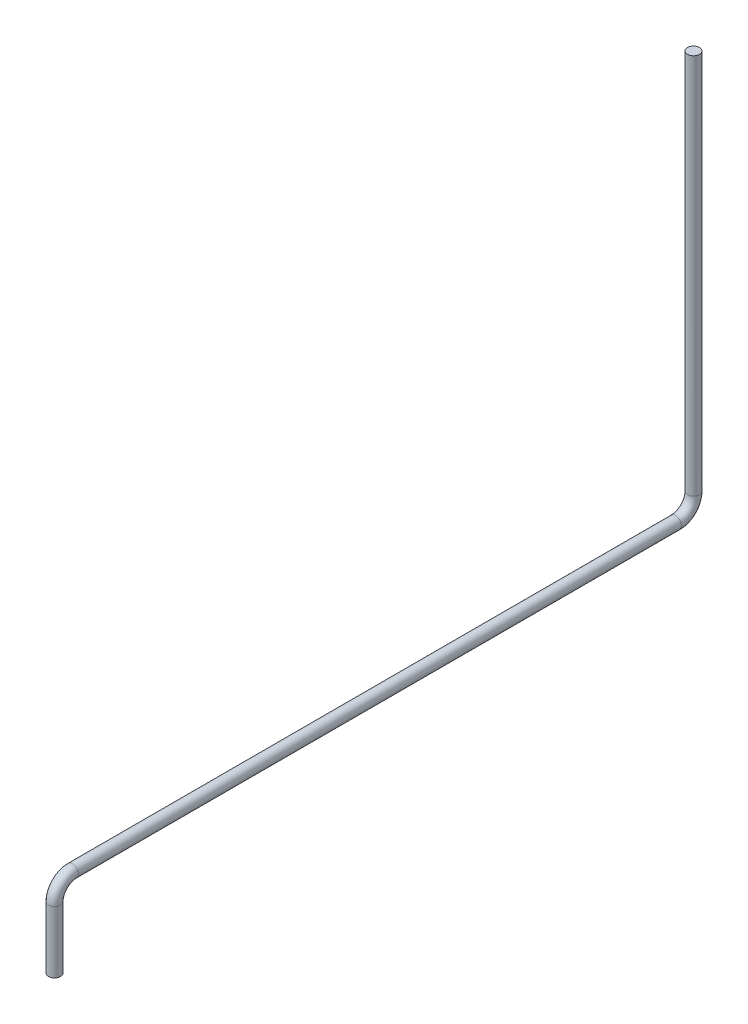
ISO-10303-21;
HEADER;
FILE_DESCRIPTION(('STEP AP214'),'2;1');
FILE_NAME('part.step','',(''),(''),'','','');
FILE_SCHEMA(('AUTOMOTIVE_DESIGN { 1 0 10303 214 1 1 1 1 }'));
ENDSEC;
DATA;
#1=APPLICATION_CONTEXT('core data for automotive mechanical design processes');
#2=APPLICATION_PROTOCOL_DEFINITION('international standard','automotive_design',2000,#1);
#3=PRODUCT_CONTEXT('',#1,'mechanical');
#4=PRODUCT('Part','Part','',(#3));
#5=PRODUCT_RELATED_PRODUCT_CATEGORY('part','',(#4));
#6=PRODUCT_DEFINITION_FORMATION('','',#4);
#7=PRODUCT_DEFINITION_CONTEXT('part definition',#1,'design');
#8=PRODUCT_DEFINITION('design','',#6,#7);
#9=PRODUCT_DEFINITION_SHAPE('','',#8);
#10=(LENGTH_UNIT() NAMED_UNIT(*) SI_UNIT(.MILLI.,.METRE.));
#11=(NAMED_UNIT(*) PLANE_ANGLE_UNIT() SI_UNIT($,.RADIAN.));
#12=(NAMED_UNIT(*) SI_UNIT($,.STERADIAN.) SOLID_ANGLE_UNIT());
#13=UNCERTAINTY_MEASURE_WITH_UNIT(LENGTH_MEASURE(1.E-05),#10,'distance_accuracy_value','');
#14=(GEOMETRIC_REPRESENTATION_CONTEXT(3) GLOBAL_UNCERTAINTY_ASSIGNED_CONTEXT((#13)) GLOBAL_UNIT_ASSIGNED_CONTEXT((#10,
#11,#12)) REPRESENTATION_CONTEXT('',''));
#15=CARTESIAN_POINT('',(0.,0.,0.));
#16=DIRECTION('',(0.,0.,1.));
#17=DIRECTION('',(1.,0.,0.));
#18=AXIS2_PLACEMENT_3D('',#15,#16,#17);
#19=CARTESIAN_POINT('',(0.,-100.,0.));
#20=DIRECTION('',(0.,1.,0.));
#21=DIRECTION('',(0.,0.,1.));
#22=AXIS2_PLACEMENT_3D('',#19,#20,#21);
#23=CYLINDRICAL_SURFACE('',#22,15.);
#24=CARTESIAN_POINT('',(0.,0.,0.));
#25=DIRECTION('',(0.,1.,0.));
#26=DIRECTION('',(0.,0.,1.));
#27=AXIS2_PLACEMENT_3D('',#24,#25,#26);
#28=CIRCLE('',#27,15.);
#29=CARTESIAN_POINT('',(0.,0.,15.));
#30=VERTEX_POINT('',#29);
#31=EDGE_CURVE('E11',#30,#30,#28,.T.);
#32=ORIENTED_EDGE('',*,*,#31,.F.);
#33=EDGE_LOOP('',(#32));
#34=FACE_BOUND('',#33,.T.);
#35=CARTESIAN_POINT('',(0.,-955.,0.));
#36=DIRECTION('',(0.,-1.,0.));
#37=DIRECTION('',(0.,0.,-1.));
#38=AXIS2_PLACEMENT_3D('',#35,#36,#37);
#39=CIRCLE('',#38,15.);
#40=CARTESIAN_POINT('',(0.,-955.,-15.));
#41=VERTEX_POINT('',#40);
#42=EDGE_CURVE('E57',#41,#41,#39,.T.);
#43=ORIENTED_EDGE('',*,*,#42,.F.);
#44=EDGE_LOOP('',(#43));
#45=FACE_BOUND('',#44,.T.);
#46=ADVANCED_FACE('F35',(#34,#45),#23,.T.);
#47=CARTESIAN_POINT('',(0.,0.,0.));
#48=DIRECTION('',(0.,1.,0.));
#49=DIRECTION('',(0.,0.,1.));
#50=AXIS2_PLACEMENT_3D('',#47,#48,#49);
#51=PLANE('',#50);
#52=ORIENTED_EDGE('',*,*,#31,.T.);
#53=EDGE_LOOP('',(#52));
#54=FACE_BOUND('',#53,.T.);
#55=ADVANCED_FACE('F64',(#54),#51,.T.);
#56=CARTESIAN_POINT('',(0.,-1200.,1600.));
#57=DIRECTION('',(0.,-1.,0.));
#58=DIRECTION('',(0.,0.,-1.));
#59=AXIS2_PLACEMENT_3D('',#56,#57,#58);
#60=PLANE('',#59);
#61=CARTESIAN_POINT('',(0.,-1200.,1600.));
#62=DIRECTION('',(0.,-1.,0.));
#63=DIRECTION('',(0.,0.,-1.));
#64=AXIS2_PLACEMENT_3D('',#61,#62,#63);
#65=CIRCLE('',#64,15.);
#66=CARTESIAN_POINT('',(0.,-1200.,1585.));
#67=VERTEX_POINT('',#66);
#68=EDGE_CURVE('E41',#67,#67,#65,.T.);
#69=ORIENTED_EDGE('',*,*,#68,.T.);
#70=EDGE_LOOP('',(#69));
#71=FACE_BOUND('',#70,.T.);
#72=ADVANCED_FACE('F45',(#71),#60,.T.);
#73=CARTESIAN_POINT('',(0.,-955.,45.));
#74=DIRECTION('',(-1.,0.,0.));
#75=DIRECTION('',(0.,0.,1.));
#76=AXIS2_PLACEMENT_3D('',#73,#74,#75);
#77=TOROIDAL_SURFACE('',#76,45.,15.);
#78=CARTESIAN_POINT('',(0.,-1000.,45.));
#79=DIRECTION('',(0.,0.,1.));
#80=DIRECTION('',(0.,-1.,0.));
#81=AXIS2_PLACEMENT_3D('',#78,#79,#80);
#82=CIRCLE('',#81,15.);
#83=CARTESIAN_POINT('',(0.,-1015.,45.));
#84=VERTEX_POINT('',#83);
#85=EDGE_CURVE('E54',#84,#84,#82,.T.);
#86=CARTESIAN_POINT('',(0.,-955.,45.));
#87=DIRECTION('',(-1.,0.,0.));
#88=DIRECTION('',(0.,0.,1.));
#89=AXIS2_PLACEMENT_3D('',#86,#87,#88);
#90=CIRCLE('',#89,60.);
#91=EDGE_CURVE('',#41,#84,#90,.T.);
#92=ORIENTED_EDGE('',*,*,#42,.T.);
#93=ORIENTED_EDGE('',*,*,#85,.F.);
#94=ORIENTED_EDGE('',*,*,#91,.T.);
#95=ORIENTED_EDGE('',*,*,#91,.F.);
#96=EDGE_LOOP('',(#92,#94,#93,#95));
#97=FACE_BOUND('',#96,.T.);
#98=ADVANCED_FACE('F61',(#97),#77,.T.);
#99=CARTESIAN_POINT('',(0.,-1000.,45.));
#100=DIRECTION('',(0.,0.,1.));
#101=DIRECTION('',(1.,0.,0.));
#102=AXIS2_PLACEMENT_3D('',#99,#100,#101);
#103=CYLINDRICAL_SURFACE('',#102,15.);
#104=CARTESIAN_POINT('',(0.,-1000.,1555.));
#105=DIRECTION('',(0.,0.,1.));
#106=DIRECTION('',(0.,-1.,0.));
#107=AXIS2_PLACEMENT_3D('',#104,#105,#106);
#108=CIRCLE('',#107,15.);
#109=CARTESIAN_POINT('',(0.,-985.,1555.));
#110=VERTEX_POINT('',#109);
#111=EDGE_CURVE('E49',#110,#110,#108,.T.);
#112=ORIENTED_EDGE('',*,*,#111,.F.);
#113=EDGE_LOOP('',(#112));
#114=FACE_BOUND('',#113,.T.);
#115=ORIENTED_EDGE('',*,*,#85,.T.);
#116=EDGE_LOOP('',(#115));
#117=FACE_BOUND('',#116,.T.);
#118=ADVANCED_FACE('F82',(#114,#117),#103,.T.);
#119=CARTESIAN_POINT('',(0.,-1045.,1555.));
#120=DIRECTION('',(1.,0.,0.));
#121=DIRECTION('',(0.,0.,-1.));
#122=AXIS2_PLACEMENT_3D('',#119,#120,#121);
#123=TOROIDAL_SURFACE('',#122,44.9999999999999,15.);
#124=CARTESIAN_POINT('',(0.,-1045.,1600.));
#125=DIRECTION('',(0.,-1.,0.));
#126=DIRECTION('',(0.,0.,-1.));
#127=AXIS2_PLACEMENT_3D('',#124,#125,#126);
#128=CIRCLE('',#127,15.);
#129=CARTESIAN_POINT('',(0.,-1045.,1615.));
#130=VERTEX_POINT('',#129);
#131=EDGE_CURVE('E47',#130,#130,#128,.T.);
#132=CARTESIAN_POINT('',(0.,-1045.,1555.));
#133=DIRECTION('',(1.,0.,0.));
#134=DIRECTION('',(0.,0.,-1.));
#135=AXIS2_PLACEMENT_3D('',#132,#133,#134);
#136=CIRCLE('',#135,59.9999999999999);
#137=EDGE_CURVE('',#110,#130,#136,.T.);
#138=ORIENTED_EDGE('',*,*,#111,.T.);
#139=ORIENTED_EDGE('',*,*,#131,.F.);
#140=ORIENTED_EDGE('',*,*,#137,.T.);
#141=ORIENTED_EDGE('',*,*,#137,.F.);
#142=EDGE_LOOP('',(#138,#140,#139,#141));
#143=FACE_BOUND('',#142,.T.);
#144=ADVANCED_FACE('F77',(#143),#123,.T.);
#145=CARTESIAN_POINT('',(0.,-1045.,1600.));
#146=DIRECTION('',(0.,-1.,0.));
#147=DIRECTION('',(0.,0.,-1.));
#148=AXIS2_PLACEMENT_3D('',#145,#146,#147);
#149=CYLINDRICAL_SURFACE('',#148,15.);
#150=ORIENTED_EDGE('',*,*,#68,.F.);
#151=EDGE_LOOP('',(#150));
#152=FACE_BOUND('',#151,.T.);
#153=ORIENTED_EDGE('',*,*,#131,.T.);
#154=EDGE_LOOP('',(#153));
#155=FACE_BOUND('',#154,.T.);
#156=ADVANCED_FACE('F70',(#152,#155),#149,.T.);
#157=CLOSED_SHELL('',(#46,#55,#72,#98,#118,#144,#156));
#158=MANIFOLD_SOLID_BREP('B2',#157);
#159=ADVANCED_BREP_SHAPE_REPRESENTATION('',(#18,#158),#14);
#160=SHAPE_DEFINITION_REPRESENTATION(#9,#159);
ENDSEC;
END-ISO-10303-21;
